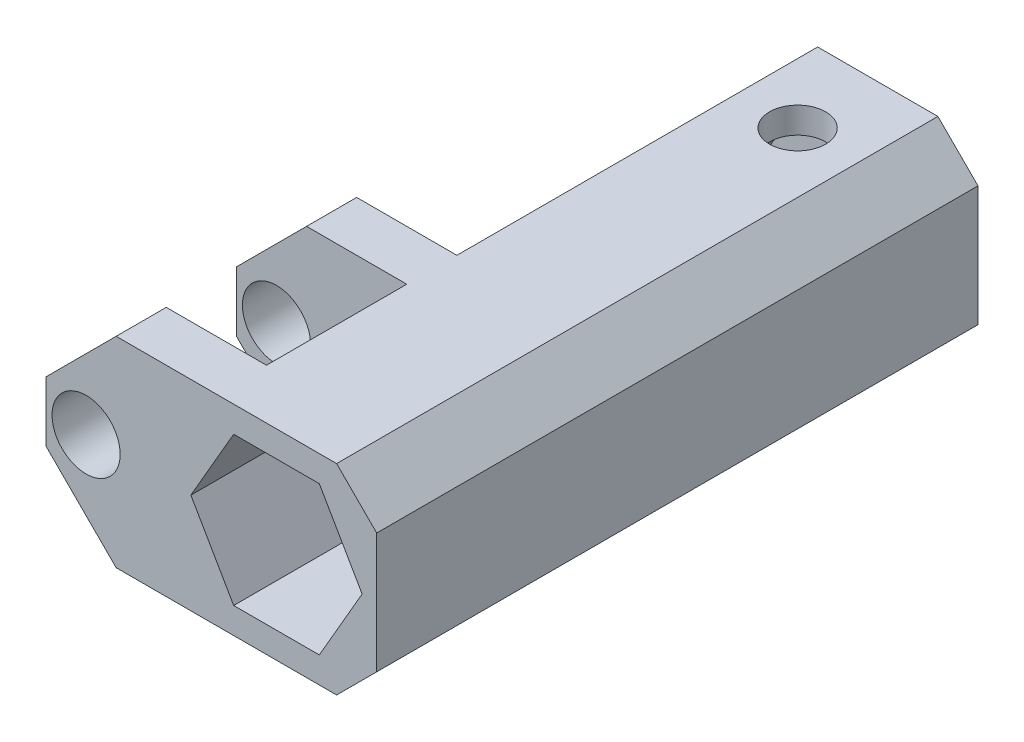
ISO-10303-21;
HEADER;
FILE_DESCRIPTION(('STEP AP214'),'2;1');
FILE_NAME('part.step','',(''),(''),'','','');
FILE_SCHEMA(('AUTOMOTIVE_DESIGN { 1 0 10303 214 1 1 1 1 }'));
ENDSEC;
DATA;
#1=APPLICATION_CONTEXT('core data for automotive mechanical design processes');
#2=APPLICATION_PROTOCOL_DEFINITION('international standard','automotive_design',2000,#1);
#3=PRODUCT_CONTEXT('',#1,'mechanical');
#4=PRODUCT('Part','Part','',(#3));
#5=PRODUCT_RELATED_PRODUCT_CATEGORY('part','',(#4));
#6=PRODUCT_DEFINITION_FORMATION('','',#4);
#7=PRODUCT_DEFINITION_CONTEXT('part definition',#1,'design');
#8=PRODUCT_DEFINITION('design','',#6,#7);
#9=PRODUCT_DEFINITION_SHAPE('','',#8);
#10=(LENGTH_UNIT() NAMED_UNIT(*) SI_UNIT(.MILLI.,.METRE.));
#11=(NAMED_UNIT(*) PLANE_ANGLE_UNIT() SI_UNIT($,.RADIAN.));
#12=(NAMED_UNIT(*) SI_UNIT($,.STERADIAN.) SOLID_ANGLE_UNIT());
#13=UNCERTAINTY_MEASURE_WITH_UNIT(LENGTH_MEASURE(1.E-05),#10,'distance_accuracy_value','');
#14=(GEOMETRIC_REPRESENTATION_CONTEXT(3) GLOBAL_UNCERTAINTY_ASSIGNED_CONTEXT((#13)) GLOBAL_UNIT_ASSIGNED_CONTEXT((#10,
#11,#12)) REPRESENTATION_CONTEXT('',''));
#15=CARTESIAN_POINT('',(0.,0.,0.));
#16=DIRECTION('',(0.,0.,1.));
#17=DIRECTION('',(1.,0.,0.));
#18=AXIS2_PLACEMENT_3D('',#15,#16,#17);
#19=CARTESIAN_POINT('',(-5.,-5.,30.));
#20=DIRECTION('',(1.,0.,0.));
#21=DIRECTION('',(0.,0.,-1.));
#22=AXIS2_PLACEMENT_3D('',#19,#20,#21);
#23=PLANE('',#22);
#24=DIRECTION('',(0.,-1.,0.));
#25=VECTOR('',#24,1.);
#26=CARTESIAN_POINT('',(-5.,5.,27.5));
#27=LINE('',#26,#25);
#28=CARTESIAN_POINT('',(-5.,3.00000000000001,27.5));
#29=VERTEX_POINT('',#28);
#30=CARTESIAN_POINT('',(-5.,-3.,27.5));
#31=VERTEX_POINT('',#30);
#32=EDGE_CURVE('E325',#29,#31,#27,.T.);
#33=ORIENTED_EDGE('',*,*,#32,.F.);
#34=DIRECTION('',(0.,0.,-1.));
#35=VECTOR('',#34,1.);
#36=CARTESIAN_POINT('',(-5.,3.00000000000001,30.));
#37=LINE('',#36,#35);
#38=CARTESIAN_POINT('',(-5.,3.00000000000001,20.5));
#39=VERTEX_POINT('',#38);
#40=EDGE_CURVE('E482',#29,#39,#37,.T.);
#41=ORIENTED_EDGE('',*,*,#40,.T.);
#42=DIRECTION('',(0.,1.,0.));
#43=VECTOR('',#42,1.);
#44=CARTESIAN_POINT('',(-5.,5.,20.5));
#45=LINE('',#44,#43);
#46=CARTESIAN_POINT('',(-5.,-3.,20.5));
#47=VERTEX_POINT('',#46);
#48=EDGE_CURVE('E488',#47,#39,#45,.T.);
#49=ORIENTED_EDGE('',*,*,#48,.F.);
#50=DIRECTION('',(0.,0.,1.));
#51=VECTOR('',#50,1.);
#52=CARTESIAN_POINT('',(-5.,-3.,30.));
#53=LINE('',#52,#51);
#54=EDGE_CURVE('E324',#47,#31,#53,.T.);
#55=ORIENTED_EDGE('',*,*,#54,.T.);
#56=EDGE_LOOP('',(#33,#41,#49,#55));
#57=FACE_BOUND('',#56,.T.);
#58=ADVANCED_FACE('F37',(#57),#23,.F.);
#59=DIRECTION('',(0.,-1.,0.));
#60=VECTOR('',#59,1.);
#61=CARTESIAN_POINT('',(-5.,5.,18.));
#62=LINE('',#61,#60);
#63=CARTESIAN_POINT('',(-5.,3.00000000000001,18.));
#64=VERTEX_POINT('',#63);
#65=CARTESIAN_POINT('',(-5.,-3.,18.));
#66=VERTEX_POINT('',#65);
#67=EDGE_CURVE('E525',#64,#66,#62,.T.);
#68=ORIENTED_EDGE('',*,*,#67,.F.);
#69=DIRECTION('',(0.,0.,-1.));
#70=VECTOR('',#69,1.);
#71=CARTESIAN_POINT('',(-5.,3.00000000000001,30.));
#72=LINE('',#71,#70);
#73=CARTESIAN_POINT('',(-5.,3.00000000000001,0.));
#74=VERTEX_POINT('',#73);
#75=EDGE_CURVE('E436',#64,#74,#72,.T.);
#76=ORIENTED_EDGE('',*,*,#75,.T.);
#77=DIRECTION('',(0.,-1.,0.));
#78=VECTOR('',#77,1.);
#79=CARTESIAN_POINT('',(-5.,-5.,0.));
#80=LINE('',#79,#78);
#81=CARTESIAN_POINT('',(-5.,-3.,0.));
#82=VERTEX_POINT('',#81);
#83=EDGE_CURVE('E259',#74,#82,#80,.T.);
#84=ORIENTED_EDGE('',*,*,#83,.T.);
#85=DIRECTION('',(0.,0.,1.));
#86=VECTOR('',#85,1.);
#87=CARTESIAN_POINT('',(-5.,-3.,30.));
#88=LINE('',#87,#86);
#89=EDGE_CURVE('E53',#82,#66,#88,.T.);
#90=ORIENTED_EDGE('',*,*,#89,.T.);
#91=EDGE_LOOP('',(#68,#76,#84,#90));
#92=FACE_BOUND('',#91,.T.);
#93=ADVANCED_FACE('F378',(#92),#23,.F.);
#94=CARTESIAN_POINT('',(5.,-5.,30.));
#95=DIRECTION('',(0.,1.,0.));
#96=DIRECTION('',(-1.,0.,0.));
#97=AXIS2_PLACEMENT_3D('',#94,#95,#96);
#98=PLANE('',#97);
#99=CARTESIAN_POINT('',(0.,-5.,4.));
#100=DIRECTION('',(0.,1.,0.));
#101=DIRECTION('',(-1.,0.,0.));
#102=AXIS2_PLACEMENT_3D('',#99,#100,#101);
#103=CIRCLE('',#102,1.4);
#104=CARTESIAN_POINT('',(-1.4,-5.,4.));
#105=VERTEX_POINT('',#104);
#106=EDGE_CURVE('E551',#105,#105,#103,.T.);
#107=ORIENTED_EDGE('',*,*,#106,.T.);
#108=EDGE_LOOP('',(#107));
#109=FACE_BOUND('',#108,.T.);
#110=DIRECTION('',(0.,0.,-1.));
#111=VECTOR('',#110,1.);
#112=CARTESIAN_POINT('',(-3.00000000000001,-5.,30.));
#113=LINE('',#112,#111);
#114=CARTESIAN_POINT('',(-3.00000000000001,-5.,27.5));
#115=VERTEX_POINT('',#114);
#116=CARTESIAN_POINT('',(-3.00000000000001,-5.,20.5));
#117=VERTEX_POINT('',#116);
#118=EDGE_CURVE('E468',#115,#117,#113,.T.);
#119=ORIENTED_EDGE('',*,*,#118,.T.);
#120=DIRECTION('',(1.,0.,0.));
#121=VECTOR('',#120,1.);
#122=CARTESIAN_POINT('',(-11.5,-5.,20.5));
#123=LINE('',#122,#121);
#124=CARTESIAN_POINT('',(-7.99999999999998,-5.,20.5));
#125=VERTEX_POINT('',#124);
#126=EDGE_CURVE('E497',#125,#117,#123,.T.);
#127=ORIENTED_EDGE('',*,*,#126,.F.);
#128=DIRECTION('',(0.,0.,-1.));
#129=VECTOR('',#128,1.);
#130=CARTESIAN_POINT('',(-7.99999999999998,-5.,30.));
#131=LINE('',#130,#129);
#132=CARTESIAN_POINT('',(-7.99999999999998,-5.,18.));
#133=VERTEX_POINT('',#132);
#134=EDGE_CURVE('E296',#125,#133,#131,.T.);
#135=ORIENTED_EDGE('',*,*,#134,.T.);
#136=DIRECTION('',(1.,0.,0.));
#137=VECTOR('',#136,1.);
#138=CARTESIAN_POINT('',(-11.5,-5.,18.));
#139=LINE('',#138,#137);
#140=CARTESIAN_POINT('',(-3.00000000000001,-5.,18.));
#141=VERTEX_POINT('',#140);
#142=EDGE_CURVE('E521',#133,#141,#139,.T.);
#143=ORIENTED_EDGE('',*,*,#142,.T.);
#144=DIRECTION('',(0.,0.,-1.));
#145=VECTOR('',#144,1.);
#146=CARTESIAN_POINT('',(-3.00000000000001,-5.,30.));
#147=LINE('',#146,#145);
#148=CARTESIAN_POINT('',(-3.,-5.,0.));
#149=VERTEX_POINT('',#148);
#150=EDGE_CURVE('E473',#141,#149,#147,.T.);
#151=ORIENTED_EDGE('',*,*,#150,.T.);
#152=DIRECTION('',(1.,0.,0.));
#153=VECTOR('',#152,1.);
#154=CARTESIAN_POINT('',(5.,-5.,0.));
#155=LINE('',#154,#153);
#156=CARTESIAN_POINT('',(3.,-5.,0.));
#157=VERTEX_POINT('',#156);
#158=EDGE_CURVE('E272',#149,#157,#155,.T.);
#159=ORIENTED_EDGE('',*,*,#158,.T.);
#160=DIRECTION('',(0.,0.,1.));
#161=VECTOR('',#160,1.);
#162=CARTESIAN_POINT('',(3.,-5.,30.));
#163=LINE('',#162,#161);
#164=CARTESIAN_POINT('',(3.,-5.,30.));
#165=VERTEX_POINT('',#164);
#166=EDGE_CURVE('E471',#157,#165,#163,.T.);
#167=ORIENTED_EDGE('',*,*,#166,.T.);
#168=DIRECTION('',(1.,0.,0.));
#169=VECTOR('',#168,1.);
#170=CARTESIAN_POINT('',(5.,-5.,30.));
#171=LINE('',#170,#169);
#172=CARTESIAN_POINT('',(-7.99999999999998,-5.,30.));
#173=VERTEX_POINT('',#172);
#174=EDGE_CURVE('E261',#173,#165,#171,.T.);
#175=ORIENTED_EDGE('',*,*,#174,.F.);
#176=DIRECTION('',(0.,0.,-1.));
#177=VECTOR('',#176,1.);
#178=CARTESIAN_POINT('',(-7.99999999999998,-5.,30.));
#179=LINE('',#178,#177);
#180=CARTESIAN_POINT('',(-7.99999999999998,-5.,27.5));
#181=VERTEX_POINT('',#180);
#182=EDGE_CURVE('E298',#173,#181,#179,.T.);
#183=ORIENTED_EDGE('',*,*,#182,.T.);
#184=DIRECTION('',(1.,0.,0.));
#185=VECTOR('',#184,1.);
#186=CARTESIAN_POINT('',(-11.5,-5.,27.5));
#187=LINE('',#186,#185);
#188=EDGE_CURVE('E289',#181,#115,#187,.T.);
#189=ORIENTED_EDGE('',*,*,#188,.T.);
#190=EDGE_LOOP('',(#119,#127,#135,#143,#151,#159,#167,#175,#183,#189));
#191=FACE_BOUND('',#190,.T.);
#192=ADVANCED_FACE('F384',(#109,#191),#98,.F.);
#193=CARTESIAN_POINT('',(5.,-5.,30.));
#194=DIRECTION('',(-1.,0.,0.));
#195=DIRECTION('',(0.,0.,1.));
#196=AXIS2_PLACEMENT_3D('',#193,#194,#195);
#197=PLANE('',#196);
#198=DIRECTION('',(0.,1.,0.));
#199=VECTOR('',#198,1.);
#200=CARTESIAN_POINT('',(5.,-5.,30.));
#201=LINE('',#200,#199);
#202=CARTESIAN_POINT('',(5.,-3.,30.));
#203=VERTEX_POINT('',#202);
#204=CARTESIAN_POINT('',(5.,2.99999999999999,30.));
#205=VERTEX_POINT('',#204);
#206=EDGE_CURVE('E264',#203,#205,#201,.T.);
#207=ORIENTED_EDGE('',*,*,#206,.F.);
#208=DIRECTION('',(0.,0.,-1.));
#209=VECTOR('',#208,1.);
#210=CARTESIAN_POINT('',(5.,-3.,30.));
#211=LINE('',#210,#209);
#212=CARTESIAN_POINT('',(5.,-3.00000000000001,0.));
#213=VERTEX_POINT('',#212);
#214=EDGE_CURVE('E463',#203,#213,#211,.T.);
#215=ORIENTED_EDGE('',*,*,#214,.T.);
#216=DIRECTION('',(0.,1.,0.));
#217=VECTOR('',#216,1.);
#218=CARTESIAN_POINT('',(5.,-5.,0.));
#219=LINE('',#218,#217);
#220=CARTESIAN_POINT('',(5.,2.99999999999999,0.));
#221=VERTEX_POINT('',#220);
#222=EDGE_CURVE('E275',#213,#221,#219,.T.);
#223=ORIENTED_EDGE('',*,*,#222,.T.);
#224=DIRECTION('',(0.,0.,1.));
#225=VECTOR('',#224,1.);
#226=CARTESIAN_POINT('',(5.,2.99999999999999,30.));
#227=LINE('',#226,#225);
#228=EDGE_CURVE('E466',#221,#205,#227,.T.);
#229=ORIENTED_EDGE('',*,*,#228,.T.);
#230=EDGE_LOOP('',(#207,#215,#223,#229));
#231=FACE_BOUND('',#230,.T.);
#232=ADVANCED_FACE('F670',(#231),#197,.F.);
#233=CARTESIAN_POINT('',(5.,5.,30.));
#234=DIRECTION('',(0.,-1.,0.));
#235=DIRECTION('',(1.,0.,0.));
#236=AXIS2_PLACEMENT_3D('',#233,#234,#235);
#237=PLANE('',#236);
#238=CARTESIAN_POINT('',(0.,5.,4.));
#239=DIRECTION('',(0.,1.,0.));
#240=DIRECTION('',(-1.,0.,0.));
#241=AXIS2_PLACEMENT_3D('',#238,#239,#240);
#242=CIRCLE('',#241,1.4);
#243=CARTESIAN_POINT('',(-1.4,5.,4.));
#244=VERTEX_POINT('',#243);
#245=EDGE_CURVE('E548',#244,#244,#242,.T.);
#246=ORIENTED_EDGE('',*,*,#245,.F.);
#247=EDGE_LOOP('',(#246));
#248=FACE_BOUND('',#247,.T.);
#249=DIRECTION('',(1.,0.,0.));
#250=VECTOR('',#249,1.);
#251=CARTESIAN_POINT('',(-11.5,5.,20.5));
#252=LINE('',#251,#250);
#253=CARTESIAN_POINT('',(-7.99999999999999,5.,20.5));
#254=VERTEX_POINT('',#253);
#255=CARTESIAN_POINT('',(-3.,5.,20.5));
#256=VERTEX_POINT('',#255);
#257=EDGE_CURVE('E330',#254,#256,#252,.T.);
#258=ORIENTED_EDGE('',*,*,#257,.T.);
#259=DIRECTION('',(0.,0.,1.));
#260=VECTOR('',#259,1.);
#261=CARTESIAN_POINT('',(-3.,5.,30.));
#262=LINE('',#261,#260);
#263=CARTESIAN_POINT('',(-3.,5.,27.5));
#264=VERTEX_POINT('',#263);
#265=EDGE_CURVE('E476',#256,#264,#262,.T.);
#266=ORIENTED_EDGE('',*,*,#265,.T.);
#267=DIRECTION('',(1.,0.,0.));
#268=VECTOR('',#267,1.);
#269=CARTESIAN_POINT('',(-11.5,5.,27.5));
#270=LINE('',#269,#268);
#271=CARTESIAN_POINT('',(-7.99999999999999,5.,27.5));
#272=VERTEX_POINT('',#271);
#273=EDGE_CURVE('E292',#272,#264,#270,.T.);
#274=ORIENTED_EDGE('',*,*,#273,.F.);
#275=DIRECTION('',(0.,0.,1.));
#276=VECTOR('',#275,1.);
#277=CARTESIAN_POINT('',(-7.99999999999999,5.,30.));
#278=LINE('',#277,#276);
#279=CARTESIAN_POINT('',(-7.99999999999999,5.,30.));
#280=VERTEX_POINT('',#279);
#281=EDGE_CURVE('E307',#272,#280,#278,.T.);
#282=ORIENTED_EDGE('',*,*,#281,.T.);
#283=DIRECTION('',(-1.,0.,0.));
#284=VECTOR('',#283,1.);
#285=CARTESIAN_POINT('',(5.,5.,30.));
#286=LINE('',#285,#284);
#287=CARTESIAN_POINT('',(3.,5.,30.));
#288=VERTEX_POINT('',#287);
#289=EDGE_CURVE('E268',#288,#280,#286,.T.);
#290=ORIENTED_EDGE('',*,*,#289,.F.);
#291=DIRECTION('',(0.,0.,-1.));
#292=VECTOR('',#291,1.);
#293=CARTESIAN_POINT('',(3.,5.,30.));
#294=LINE('',#293,#292);
#295=CARTESIAN_POINT('',(3.,5.,0.));
#296=VERTEX_POINT('',#295);
#297=EDGE_CURVE('E479',#288,#296,#294,.T.);
#298=ORIENTED_EDGE('',*,*,#297,.T.);
#299=DIRECTION('',(-1.,0.,0.));
#300=VECTOR('',#299,1.);
#301=CARTESIAN_POINT('',(5.,5.,0.));
#302=LINE('',#301,#300);
#303=CARTESIAN_POINT('',(-3.,5.,0.));
#304=VERTEX_POINT('',#303);
#305=EDGE_CURVE('E265',#296,#304,#302,.T.);
#306=ORIENTED_EDGE('',*,*,#305,.T.);
#307=DIRECTION('',(0.,0.,1.));
#308=VECTOR('',#307,1.);
#309=CARTESIAN_POINT('',(-3.,5.,30.));
#310=LINE('',#309,#308);
#311=CARTESIAN_POINT('',(-3.,5.,18.));
#312=VERTEX_POINT('',#311);
#313=EDGE_CURVE('E434',#304,#312,#310,.T.);
#314=ORIENTED_EDGE('',*,*,#313,.T.);
#315=DIRECTION('',(1.,0.,0.));
#316=VECTOR('',#315,1.);
#317=CARTESIAN_POINT('',(-11.5,5.,18.));
#318=LINE('',#317,#316);
#319=CARTESIAN_POINT('',(-7.99999999999999,5.,18.));
#320=VERTEX_POINT('',#319);
#321=EDGE_CURVE('E519',#320,#312,#318,.T.);
#322=ORIENTED_EDGE('',*,*,#321,.F.);
#323=DIRECTION('',(0.,0.,1.));
#324=VECTOR('',#323,1.);
#325=CARTESIAN_POINT('',(-7.99999999999999,5.,30.));
#326=LINE('',#325,#324);
#327=EDGE_CURVE('E305',#320,#254,#326,.T.);
#328=ORIENTED_EDGE('',*,*,#327,.T.);
#329=EDGE_LOOP('',(#258,#266,#274,#282,#290,#298,#306,#314,#322,#328));
#330=FACE_BOUND('',#329,.T.);
#331=ADVANCED_FACE('F674',(#248,#330),#237,.F.);
#332=CARTESIAN_POINT('',(0.,0.,30.));
#333=DIRECTION('',(0.,0.,1.));
#334=DIRECTION('',(1.,0.,0.));
#335=AXIS2_PLACEMENT_3D('',#332,#333,#334);
#336=PLANE('',#335);
#337=CARTESIAN_POINT('',(-9.5,0.,30.));
#338=DIRECTION('',(0.,0.,-1.));
#339=DIRECTION('',(0.,1.,0.));
#340=AXIS2_PLACEMENT_3D('',#337,#338,#339);
#341=CIRCLE('',#340,1.7);
#342=CARTESIAN_POINT('',(-9.5,1.7,30.));
#343=VERTEX_POINT('',#342);
#344=EDGE_CURVE('E539',#343,#343,#341,.T.);
#345=ORIENTED_EDGE('',*,*,#344,.T.);
#346=EDGE_LOOP('',(#345));
#347=FACE_BOUND('',#346,.T.);
#348=DIRECTION('',(-0.5,-0.866025403784439,0.));
#349=VECTOR('',#348,1.);
#350=CARTESIAN_POINT('',(-2.13619599600162,3.7,30.));
#351=LINE('',#350,#349);
#352=CARTESIAN_POINT('',(-2.13619599600162,3.7,30.));
#353=VERTEX_POINT('',#352);
#354=CARTESIAN_POINT('',(-4.27239199200323,0.,30.));
#355=VERTEX_POINT('',#354);
#356=EDGE_CURVE('E232',#353,#355,#351,.T.);
#357=ORIENTED_EDGE('',*,*,#356,.F.);
#358=DIRECTION('',(-1.,0.,0.));
#359=VECTOR('',#358,1.);
#360=CARTESIAN_POINT('',(2.13619599600162,3.7,30.));
#361=LINE('',#360,#359);
#362=CARTESIAN_POINT('',(2.13619599600162,3.7,30.));
#363=VERTEX_POINT('',#362);
#364=EDGE_CURVE('E246',#363,#353,#361,.T.);
#365=ORIENTED_EDGE('',*,*,#364,.F.);
#366=DIRECTION('',(-0.5,0.866025403784439,0.));
#367=VECTOR('',#366,1.);
#368=CARTESIAN_POINT('',(4.27239199200323,0.,30.));
#369=LINE('',#368,#367);
#370=CARTESIAN_POINT('',(4.27239199200323,0.,30.));
#371=VERTEX_POINT('',#370);
#372=EDGE_CURVE('E240',#371,#363,#369,.T.);
#373=ORIENTED_EDGE('',*,*,#372,.F.);
#374=DIRECTION('',(0.5,0.866025403784439,0.));
#375=VECTOR('',#374,1.);
#376=CARTESIAN_POINT('',(2.13619599600161,-3.7,30.));
#377=LINE('',#376,#375);
#378=CARTESIAN_POINT('',(2.13619599600161,-3.7,30.));
#379=VERTEX_POINT('',#378);
#380=EDGE_CURVE('E238',#379,#371,#377,.T.);
#381=ORIENTED_EDGE('',*,*,#380,.F.);
#382=DIRECTION('',(1.,0.,0.));
#383=VECTOR('',#382,1.);
#384=CARTESIAN_POINT('',(-2.13619599600162,-3.7,30.));
#385=LINE('',#384,#383);
#386=CARTESIAN_POINT('',(-2.13619599600162,-3.7,30.));
#387=VERTEX_POINT('',#386);
#388=EDGE_CURVE('E216',#387,#379,#385,.T.);
#389=ORIENTED_EDGE('',*,*,#388,.F.);
#390=DIRECTION('',(0.5,-0.866025403784439,0.));
#391=VECTOR('',#390,1.);
#392=CARTESIAN_POINT('',(-4.27239199200323,0.,30.));
#393=LINE('',#392,#391);
#394=EDGE_CURVE('E227',#355,#387,#393,.T.);
#395=ORIENTED_EDGE('',*,*,#394,.F.);
#396=EDGE_LOOP('',(#357,#365,#373,#381,#389,#395));
#397=FACE_BOUND('',#396,.T.);
#398=ORIENTED_EDGE('',*,*,#174,.T.);
#399=DIRECTION('',(-0.707106781186549,-0.707106781186546,0.));
#400=VECTOR('',#399,1.);
#401=CARTESIAN_POINT('',(3.99999999999999,-4.00000000000001,30.));
#402=LINE('',#401,#400);
#403=EDGE_CURVE('E451',#165,#203,#402,.F.);
#404=ORIENTED_EDGE('',*,*,#403,.T.);
#405=ORIENTED_EDGE('',*,*,#206,.T.);
#406=DIRECTION('',(0.707106781186546,-0.707106781186549,0.));
#407=VECTOR('',#406,1.);
#408=CARTESIAN_POINT('',(4.,3.99999999999999,30.));
#409=LINE('',#408,#407);
#410=EDGE_CURVE('E453',#205,#288,#409,.F.);
#411=ORIENTED_EDGE('',*,*,#410,.T.);
#412=ORIENTED_EDGE('',*,*,#289,.T.);
#413=DIRECTION('',(0.707106781186549,0.707106781186546,0.));
#414=VECTOR('',#413,1.);
#415=CARTESIAN_POINT('',(-6.49999999999998,6.5,30.));
#416=LINE('',#415,#414);
#417=CARTESIAN_POINT('',(-11.5,1.5,30.));
#418=VERTEX_POINT('',#417);
#419=EDGE_CURVE('E510',#280,#418,#416,.F.);
#420=ORIENTED_EDGE('',*,*,#419,.T.);
#421=DIRECTION('',(0.,1.,0.));
#422=VECTOR('',#421,1.);
#423=CARTESIAN_POINT('',(-11.5,5.,30.));
#424=LINE('',#423,#422);
#425=CARTESIAN_POINT('',(-11.5,-1.5,30.));
#426=VERTEX_POINT('',#425);
#427=EDGE_CURVE('E329',#426,#418,#424,.T.);
#428=ORIENTED_EDGE('',*,*,#427,.F.);
#429=DIRECTION('',(-0.707106781186549,0.707106781186546,0.));
#430=VECTOR('',#429,1.);
#431=CARTESIAN_POINT('',(-6.49999999999997,-6.5,30.));
#432=LINE('',#431,#430);
#433=EDGE_CURVE('E294',#426,#173,#432,.F.);
#434=ORIENTED_EDGE('',*,*,#433,.T.);
#435=EDGE_LOOP('',(#398,#404,#405,#411,#412,#420,#428,#434));
#436=FACE_BOUND('',#435,.T.);
#437=ADVANCED_FACE('F234',(#347,#397,#436),#336,.T.);
#438=CARTESIAN_POINT('',(0.,0.,0.));
#439=DIRECTION('',(0.,0.,1.));
#440=DIRECTION('',(1.,0.,0.));
#441=AXIS2_PLACEMENT_3D('',#438,#439,#440);
#442=PLANE('',#441);
#443=CARTESIAN_POINT('',(0.,0.,0.));
#444=DIRECTION('',(0.,0.,-1.));
#445=DIRECTION('',(-1.,0.,0.));
#446=AXIS2_PLACEMENT_3D('',#443,#444,#445);
#447=CIRCLE('',#446,1.6);
#448=CARTESIAN_POINT('',(-1.6,0.,0.));
#449=VERTEX_POINT('',#448);
#450=EDGE_CURVE('E283',#449,#449,#447,.T.);
#451=ORIENTED_EDGE('',*,*,#450,.F.);
#452=EDGE_LOOP('',(#451));
#453=FACE_BOUND('',#452,.T.);
#454=ORIENTED_EDGE('',*,*,#222,.F.);
#455=DIRECTION('',(0.707106781186549,0.707106781186546,0.));
#456=VECTOR('',#455,1.);
#457=CARTESIAN_POINT('',(5.,-3.,0.));
#458=LINE('',#457,#456);
#459=EDGE_CURVE('E455',#213,#157,#458,.F.);
#460=ORIENTED_EDGE('',*,*,#459,.T.);
#461=ORIENTED_EDGE('',*,*,#158,.F.);
#462=DIRECTION('',(0.707106781186546,-0.707106781186549,0.));
#463=VECTOR('',#462,1.);
#464=CARTESIAN_POINT('',(-3.00000000000001,-5.,0.));
#465=LINE('',#464,#463);
#466=EDGE_CURVE('E461',#149,#82,#465,.F.);
#467=ORIENTED_EDGE('',*,*,#466,.T.);
#468=ORIENTED_EDGE('',*,*,#83,.F.);
#469=DIRECTION('',(-0.707106781186549,-0.707106781186546,0.));
#470=VECTOR('',#469,1.);
#471=CARTESIAN_POINT('',(-5.,3.00000000000001,0.));
#472=LINE('',#471,#470);
#473=EDGE_CURVE('E459',#74,#304,#472,.F.);
#474=ORIENTED_EDGE('',*,*,#473,.T.);
#475=ORIENTED_EDGE('',*,*,#305,.F.);
#476=DIRECTION('',(-0.707106781186546,0.707106781186549,0.));
#477=VECTOR('',#476,1.);
#478=CARTESIAN_POINT('',(3.,5.,0.));
#479=LINE('',#478,#477);
#480=EDGE_CURVE('E457',#296,#221,#479,.F.);
#481=ORIENTED_EDGE('',*,*,#480,.T.);
#482=EDGE_LOOP('',(#454,#460,#461,#467,#468,#474,#475,#481));
#483=FACE_BOUND('',#482,.T.);
#484=ADVANCED_FACE('F759',(#453,#483),#442,.F.);
#485=CARTESIAN_POINT('',(-2.13619599600162,3.7,-11.3036867142244));
#486=DIRECTION('',(-0.866025403784439,0.5,0.));
#487=DIRECTION('',(-0.5,-0.866025403784439,0.));
#488=AXIS2_PLACEMENT_3D('',#485,#486,#487);
#489=PLANE('',#488);
#490=DIRECTION('',(0.5,0.866025403784439,0.));
#491=VECTOR('',#490,1.);
#492=CARTESIAN_POINT('',(-2.13619599600162,3.7,2.));
#493=LINE('',#492,#491);
#494=CARTESIAN_POINT('',(-4.27239199200323,0.,2.));
#495=VERTEX_POINT('',#494);
#496=CARTESIAN_POINT('',(-2.13619599600162,3.7,2.));
#497=VERTEX_POINT('',#496);
#498=EDGE_CURVE('E260',#495,#497,#493,.T.);
#499=ORIENTED_EDGE('',*,*,#498,.T.);
#500=DIRECTION('',(0.,0.,1.));
#501=VECTOR('',#500,1.);
#502=CARTESIAN_POINT('',(-2.13619599600162,3.7,-11.3036867142244));
#503=LINE('',#502,#501);
#504=EDGE_CURVE('E249',#497,#353,#503,.T.);
#505=ORIENTED_EDGE('',*,*,#504,.T.);
#506=ORIENTED_EDGE('',*,*,#356,.T.);
#507=DIRECTION('',(0.,0.,1.));
#508=VECTOR('',#507,1.);
#509=CARTESIAN_POINT('',(-4.27239199200323,0.,-11.3036867142244));
#510=LINE('',#509,#508);
#511=EDGE_CURVE('E223',#495,#355,#510,.T.);
#512=ORIENTED_EDGE('',*,*,#511,.F.);
#513=EDGE_LOOP('',(#499,#505,#506,#512));
#514=FACE_BOUND('',#513,.T.);
#515=ADVANCED_FACE('F346',(#514),#489,.F.);
#516=CARTESIAN_POINT('',(2.13619599600162,3.7,-11.3036867142244));
#517=DIRECTION('',(0.,1.,0.));
#518=DIRECTION('',(0.,0.,1.));
#519=AXIS2_PLACEMENT_3D('',#516,#517,#518);
#520=PLANE('',#519);
#521=CARTESIAN_POINT('',(0.,3.7,4.));
#522=DIRECTION('',(0.,1.,0.));
#523=DIRECTION('',(0.,0.,1.));
#524=AXIS2_PLACEMENT_3D('',#521,#522,#523);
#525=CIRCLE('',#524,1.4);
#526=CARTESIAN_POINT('',(0.,3.7,5.4));
#527=VERTEX_POINT('',#526);
#528=EDGE_CURVE('E543',#527,#527,#525,.T.);
#529=ORIENTED_EDGE('',*,*,#528,.T.);
#530=EDGE_LOOP('',(#529));
#531=FACE_BOUND('',#530,.T.);
#532=DIRECTION('',(1.,0.,0.));
#533=VECTOR('',#532,1.);
#534=CARTESIAN_POINT('',(2.13619599600162,3.7,2.));
#535=LINE('',#534,#533);
#536=CARTESIAN_POINT('',(2.13619599600162,3.7,2.));
#537=VERTEX_POINT('',#536);
#538=EDGE_CURVE('E343',#497,#537,#535,.T.);
#539=ORIENTED_EDGE('',*,*,#538,.T.);
#540=DIRECTION('',(0.,0.,1.));
#541=VECTOR('',#540,1.);
#542=CARTESIAN_POINT('',(2.13619599600162,3.7,-11.3036867142244));
#543=LINE('',#542,#541);
#544=EDGE_CURVE('E251',#537,#363,#543,.T.);
#545=ORIENTED_EDGE('',*,*,#544,.T.);
#546=ORIENTED_EDGE('',*,*,#364,.T.);
#547=ORIENTED_EDGE('',*,*,#504,.F.);
#548=EDGE_LOOP('',(#539,#545,#546,#547));
#549=FACE_BOUND('',#548,.T.);
#550=ADVANCED_FACE('F350',(#531,#549),#520,.F.);
#551=CARTESIAN_POINT('',(4.27239199200323,0.,-11.3036867142244));
#552=DIRECTION('',(0.866025403784439,0.5,0.));
#553=DIRECTION('',(-0.5,0.866025403784439,0.));
#554=AXIS2_PLACEMENT_3D('',#551,#552,#553);
#555=PLANE('',#554);
#556=DIRECTION('',(0.5,-0.866025403784439,0.));
#557=VECTOR('',#556,1.);
#558=CARTESIAN_POINT('',(4.27239199200323,0.,2.));
#559=LINE('',#558,#557);
#560=CARTESIAN_POINT('',(4.27239199200323,0.,2.));
#561=VERTEX_POINT('',#560);
#562=EDGE_CURVE('E341',#537,#561,#559,.T.);
#563=ORIENTED_EDGE('',*,*,#562,.T.);
#564=DIRECTION('',(0.,0.,1.));
#565=VECTOR('',#564,1.);
#566=CARTESIAN_POINT('',(4.27239199200323,0.,-11.3036867142244));
#567=LINE('',#566,#565);
#568=EDGE_CURVE('E253',#561,#371,#567,.T.);
#569=ORIENTED_EDGE('',*,*,#568,.T.);
#570=ORIENTED_EDGE('',*,*,#372,.T.);
#571=ORIENTED_EDGE('',*,*,#544,.F.);
#572=EDGE_LOOP('',(#563,#569,#570,#571));
#573=FACE_BOUND('',#572,.T.);
#574=ADVANCED_FACE('F355',(#573),#555,.F.);
#575=CARTESIAN_POINT('',(2.13619599600161,-3.7,-11.3036867142244));
#576=DIRECTION('',(0.866025403784439,-0.5,0.));
#577=DIRECTION('',(0.5,0.866025403784439,0.));
#578=AXIS2_PLACEMENT_3D('',#575,#576,#577);
#579=PLANE('',#578);
#580=DIRECTION('',(-0.5,-0.866025403784439,0.));
#581=VECTOR('',#580,1.);
#582=CARTESIAN_POINT('',(2.13619599600161,-3.7,2.));
#583=LINE('',#582,#581);
#584=CARTESIAN_POINT('',(2.13619599600162,-3.7,2.));
#585=VERTEX_POINT('',#584);
#586=EDGE_CURVE('E339',#561,#585,#583,.T.);
#587=ORIENTED_EDGE('',*,*,#586,.T.);
#588=DIRECTION('',(0.,0.,1.));
#589=VECTOR('',#588,1.);
#590=CARTESIAN_POINT('',(2.13619599600161,-3.7,-11.3036867142244));
#591=LINE('',#590,#589);
#592=EDGE_CURVE('E222',#585,#379,#591,.T.);
#593=ORIENTED_EDGE('',*,*,#592,.T.);
#594=ORIENTED_EDGE('',*,*,#380,.T.);
#595=ORIENTED_EDGE('',*,*,#568,.F.);
#596=EDGE_LOOP('',(#587,#593,#594,#595));
#597=FACE_BOUND('',#596,.T.);
#598=ADVANCED_FACE('F359',(#597),#579,.F.);
#599=CARTESIAN_POINT('',(-2.13619599600162,-3.7,-11.3036867142244));
#600=DIRECTION('',(0.,-1.,0.));
#601=DIRECTION('',(1.,0.,0.));
#602=AXIS2_PLACEMENT_3D('',#599,#600,#601);
#603=PLANE('',#602);
#604=CARTESIAN_POINT('',(0.,-3.7,4.));
#605=DIRECTION('',(0.,-1.,0.));
#606=DIRECTION('',(1.,0.,0.));
#607=AXIS2_PLACEMENT_3D('',#604,#605,#606);
#608=CIRCLE('',#607,1.4);
#609=CARTESIAN_POINT('',(1.4,-3.7,4.));
#610=VERTEX_POINT('',#609);
#611=EDGE_CURVE('E41',#610,#610,#608,.T.);
#612=ORIENTED_EDGE('',*,*,#611,.T.);
#613=EDGE_LOOP('',(#612));
#614=FACE_BOUND('',#613,.T.);
#615=DIRECTION('',(-1.,0.,0.));
#616=VECTOR('',#615,1.);
#617=CARTESIAN_POINT('',(-2.13619599600162,-3.7,2.));
#618=LINE('',#617,#616);
#619=CARTESIAN_POINT('',(-2.13619599600162,-3.7,2.));
#620=VERTEX_POINT('',#619);
#621=EDGE_CURVE('E219',#585,#620,#618,.T.);
#622=ORIENTED_EDGE('',*,*,#621,.T.);
#623=DIRECTION('',(0.,0.,1.));
#624=VECTOR('',#623,1.);
#625=CARTESIAN_POINT('',(-2.13619599600162,-3.7,-11.3036867142244));
#626=LINE('',#625,#624);
#627=EDGE_CURVE('E211',#620,#387,#626,.T.);
#628=ORIENTED_EDGE('',*,*,#627,.T.);
#629=ORIENTED_EDGE('',*,*,#388,.T.);
#630=ORIENTED_EDGE('',*,*,#592,.F.);
#631=EDGE_LOOP('',(#622,#628,#629,#630));
#632=FACE_BOUND('',#631,.T.);
#633=ADVANCED_FACE('F213',(#614,#632),#603,.F.);
#634=CARTESIAN_POINT('',(-4.27239199200323,0.,-11.3036867142244));
#635=DIRECTION('',(-0.866025403784439,-0.5,0.));
#636=DIRECTION('',(0.5,-0.866025403784439,0.));
#637=AXIS2_PLACEMENT_3D('',#634,#635,#636);
#638=PLANE('',#637);
#639=DIRECTION('',(-0.5,0.866025403784439,0.));
#640=VECTOR('',#639,1.);
#641=CARTESIAN_POINT('',(-4.27239199200323,0.,2.));
#642=LINE('',#641,#640);
#643=EDGE_CURVE('E257',#620,#495,#642,.T.);
#644=ORIENTED_EDGE('',*,*,#643,.T.);
#645=ORIENTED_EDGE('',*,*,#511,.T.);
#646=ORIENTED_EDGE('',*,*,#394,.T.);
#647=ORIENTED_EDGE('',*,*,#627,.F.);
#648=EDGE_LOOP('',(#644,#645,#646,#647));
#649=FACE_BOUND('',#648,.T.);
#650=ADVANCED_FACE('F228',(#649),#638,.F.);
#651=CARTESIAN_POINT('',(0.,0.,2.));
#652=DIRECTION('',(0.,0.,1.));
#653=DIRECTION('',(1.,0.,0.));
#654=AXIS2_PLACEMENT_3D('',#651,#652,#653);
#655=PLANE('',#654);
#656=CARTESIAN_POINT('',(0.,0.,2.));
#657=DIRECTION('',(0.,0.,1.));
#658=DIRECTION('',(1.,0.,0.));
#659=AXIS2_PLACEMENT_3D('',#656,#657,#658);
#660=CIRCLE('',#659,1.6);
#661=CARTESIAN_POINT('',(1.6,0.,2.));
#662=VERTEX_POINT('',#661);
#663=EDGE_CURVE('E280',#662,#662,#660,.T.);
#664=ORIENTED_EDGE('',*,*,#663,.F.);
#665=EDGE_LOOP('',(#664));
#666=FACE_BOUND('',#665,.T.);
#667=ORIENTED_EDGE('',*,*,#498,.F.);
#668=ORIENTED_EDGE('',*,*,#643,.F.);
#669=ORIENTED_EDGE('',*,*,#621,.F.);
#670=ORIENTED_EDGE('',*,*,#586,.F.);
#671=ORIENTED_EDGE('',*,*,#562,.F.);
#672=ORIENTED_EDGE('',*,*,#538,.F.);
#673=EDGE_LOOP('',(#667,#668,#669,#670,#671,#672));
#674=FACE_BOUND('',#673,.T.);
#675=ADVANCED_FACE('F362',(#666,#674),#655,.T.);
#676=CARTESIAN_POINT('',(0.,0.,30.));
#677=DIRECTION('',(0.,0.,-1.));
#678=DIRECTION('',(-1.,0.,0.));
#679=AXIS2_PLACEMENT_3D('',#676,#677,#678);
#680=CYLINDRICAL_SURFACE('',#679,1.6);
#681=ORIENTED_EDGE('',*,*,#663,.T.);
#682=EDGE_LOOP('',(#681));
#683=FACE_BOUND('',#682,.T.);
#684=ORIENTED_EDGE('',*,*,#450,.T.);
#685=EDGE_LOOP('',(#684));
#686=FACE_BOUND('',#685,.T.);
#687=ADVANCED_FACE('F364',(#683,#686),#680,.F.);
#688=CARTESIAN_POINT('',(-11.5,5.,27.5));
#689=DIRECTION('',(0.,0.,1.));
#690=DIRECTION('',(1.,0.,0.));
#691=AXIS2_PLACEMENT_3D('',#688,#689,#690);
#692=PLANE('',#691);
#693=CARTESIAN_POINT('',(-9.5,0.,27.5));
#694=DIRECTION('',(0.,0.,1.));
#695=DIRECTION('',(1.,0.,0.));
#696=AXIS2_PLACEMENT_3D('',#693,#694,#695);
#697=CIRCLE('',#696,1.7);
#698=CARTESIAN_POINT('',(-7.8,0.,27.5));
#699=VERTEX_POINT('',#698);
#700=EDGE_CURVE('E529',#699,#699,#697,.T.);
#701=ORIENTED_EDGE('',*,*,#700,.T.);
#702=EDGE_LOOP('',(#701));
#703=FACE_BOUND('',#702,.T.);
#704=ORIENTED_EDGE('',*,*,#188,.F.);
#705=DIRECTION('',(0.707106781186549,-0.707106781186546,0.));
#706=VECTOR('',#705,1.);
#707=CARTESIAN_POINT('',(-11.5,-1.5,27.5));
#708=LINE('',#707,#706);
#709=CARTESIAN_POINT('',(-11.5,-1.5,27.5));
#710=VERTEX_POINT('',#709);
#711=EDGE_CURVE('E303',#181,#710,#708,.F.);
#712=ORIENTED_EDGE('',*,*,#711,.T.);
#713=DIRECTION('',(0.,-1.,0.));
#714=VECTOR('',#713,1.);
#715=CARTESIAN_POINT('',(-11.5,5.,27.5));
#716=LINE('',#715,#714);
#717=CARTESIAN_POINT('',(-11.5,1.5,27.5));
#718=VERTEX_POINT('',#717);
#719=EDGE_CURVE('E293',#718,#710,#716,.T.);
#720=ORIENTED_EDGE('',*,*,#719,.F.);
#721=DIRECTION('',(-0.707106781186549,-0.707106781186546,0.));
#722=VECTOR('',#721,1.);
#723=CARTESIAN_POINT('',(-11.5,1.5,27.5));
#724=LINE('',#723,#722);
#725=EDGE_CURVE('E300',#718,#272,#724,.F.);
#726=ORIENTED_EDGE('',*,*,#725,.T.);
#727=ORIENTED_EDGE('',*,*,#273,.T.);
#728=DIRECTION('',(0.707106781186549,0.707106781186546,0.));
#729=VECTOR('',#728,1.);
#730=CARTESIAN_POINT('',(-7.25000000000002,0.749999999999998,27.5));
#731=LINE('',#730,#729);
#732=EDGE_CURVE('E444',#264,#29,#731,.F.);
#733=ORIENTED_EDGE('',*,*,#732,.T.);
#734=ORIENTED_EDGE('',*,*,#32,.T.);
#735=DIRECTION('',(-0.707106781186546,0.707106781186549,0.));
#736=VECTOR('',#735,1.);
#737=CARTESIAN_POINT('',(-12.25,4.25000000000002,27.5));
#738=LINE('',#737,#736);
#739=EDGE_CURVE('E437',#31,#115,#738,.F.);
#740=ORIENTED_EDGE('',*,*,#739,.T.);
#741=EDGE_LOOP('',(#704,#712,#720,#726,#727,#733,#734,#740));
#742=FACE_BOUND('',#741,.T.);
#743=ADVANCED_FACE('F371',(#703,#742),#692,.F.);
#744=CARTESIAN_POINT('',(-11.5,0.,0.));
#745=DIRECTION('',(1.,0.,0.));
#746=DIRECTION('',(0.,0.,-1.));
#747=AXIS2_PLACEMENT_3D('',#744,#745,#746);
#748=PLANE('',#747);
#749=ORIENTED_EDGE('',*,*,#719,.T.);
#750=DIRECTION('',(0.,0.,1.));
#751=VECTOR('',#750,1.);
#752=CARTESIAN_POINT('',(-11.5,-1.5,0.));
#753=LINE('',#752,#751);
#754=EDGE_CURVE('E506',#710,#426,#753,.T.);
#755=ORIENTED_EDGE('',*,*,#754,.T.);
#756=ORIENTED_EDGE('',*,*,#427,.T.);
#757=DIRECTION('',(0.,0.,-1.));
#758=VECTOR('',#757,1.);
#759=CARTESIAN_POINT('',(-11.5,1.5,0.));
#760=LINE('',#759,#758);
#761=EDGE_CURVE('E270',#418,#718,#760,.T.);
#762=ORIENTED_EDGE('',*,*,#761,.T.);
#763=EDGE_LOOP('',(#749,#755,#756,#762));
#764=FACE_BOUND('',#763,.T.);
#765=ADVANCED_FACE('F514',(#764),#748,.F.);
#766=CARTESIAN_POINT('',(-11.5,5.,20.5));
#767=DIRECTION('',(0.,0.,-1.));
#768=DIRECTION('',(-1.,0.,0.));
#769=AXIS2_PLACEMENT_3D('',#766,#767,#768);
#770=PLANE('',#769);
#771=CARTESIAN_POINT('',(-9.5,0.,20.5));
#772=DIRECTION('',(0.,0.,-1.));
#773=DIRECTION('',(-1.,0.,0.));
#774=AXIS2_PLACEMENT_3D('',#771,#772,#773);
#775=CIRCLE('',#774,1.7);
#776=CARTESIAN_POINT('',(-11.2,0.,20.5));
#777=VERTEX_POINT('',#776);
#778=EDGE_CURVE('E536',#777,#777,#775,.T.);
#779=ORIENTED_EDGE('',*,*,#778,.T.);
#780=EDGE_LOOP('',(#779));
#781=FACE_BOUND('',#780,.T.);
#782=DIRECTION('',(0.,1.,0.));
#783=VECTOR('',#782,1.);
#784=CARTESIAN_POINT('',(-11.5,5.,20.5));
#785=LINE('',#784,#783);
#786=CARTESIAN_POINT('',(-11.5,-1.5,20.5));
#787=VERTEX_POINT('',#786);
#788=CARTESIAN_POINT('',(-11.5,1.5,20.5));
#789=VERTEX_POINT('',#788);
#790=EDGE_CURVE('E527',#787,#789,#785,.T.);
#791=ORIENTED_EDGE('',*,*,#790,.F.);
#792=DIRECTION('',(-0.707106781186549,0.707106781186546,0.));
#793=VECTOR('',#792,1.);
#794=CARTESIAN_POINT('',(-11.5,-1.5,20.5));
#795=LINE('',#794,#793);
#796=EDGE_CURVE('E318',#787,#125,#795,.F.);
#797=ORIENTED_EDGE('',*,*,#796,.T.);
#798=ORIENTED_EDGE('',*,*,#126,.T.);
#799=DIRECTION('',(0.707106781186546,-0.707106781186549,0.));
#800=VECTOR('',#799,1.);
#801=CARTESIAN_POINT('',(-12.25,4.25000000000002,20.5));
#802=LINE('',#801,#800);
#803=EDGE_CURVE('E440',#117,#47,#802,.F.);
#804=ORIENTED_EDGE('',*,*,#803,.T.);
#805=ORIENTED_EDGE('',*,*,#48,.T.);
#806=DIRECTION('',(-0.707106781186549,-0.707106781186546,0.));
#807=VECTOR('',#806,1.);
#808=CARTESIAN_POINT('',(-7.25000000000002,0.749999999999999,20.5));
#809=LINE('',#808,#807);
#810=EDGE_CURVE('E446',#39,#256,#809,.F.);
#811=ORIENTED_EDGE('',*,*,#810,.T.);
#812=ORIENTED_EDGE('',*,*,#257,.F.);
#813=DIRECTION('',(0.707106781186549,0.707106781186546,0.));
#814=VECTOR('',#813,1.);
#815=CARTESIAN_POINT('',(-11.5,1.5,20.5));
#816=LINE('',#815,#814);
#817=EDGE_CURVE('E316',#254,#789,#816,.F.);
#818=ORIENTED_EDGE('',*,*,#817,.T.);
#819=EDGE_LOOP('',(#791,#797,#798,#804,#805,#811,#812,#818));
#820=FACE_BOUND('',#819,.T.);
#821=ADVANCED_FACE('F577',(#781,#820),#770,.F.);
#822=CARTESIAN_POINT('',(-11.5,5.,18.));
#823=DIRECTION('',(0.,0.,1.));
#824=DIRECTION('',(1.,0.,0.));
#825=AXIS2_PLACEMENT_3D('',#822,#823,#824);
#826=PLANE('',#825);
#827=CARTESIAN_POINT('',(-9.5,0.,18.));
#828=DIRECTION('',(0.,0.,-1.));
#829=DIRECTION('',(0.,1.,0.));
#830=AXIS2_PLACEMENT_3D('',#827,#828,#829);
#831=CIRCLE('',#830,1.7);
#832=CARTESIAN_POINT('',(-9.5,1.7,18.));
#833=VERTEX_POINT('',#832);
#834=EDGE_CURVE('E540',#833,#833,#831,.T.);
#835=ORIENTED_EDGE('',*,*,#834,.F.);
#836=EDGE_LOOP('',(#835));
#837=FACE_BOUND('',#836,.T.);
#838=ORIENTED_EDGE('',*,*,#142,.F.);
#839=DIRECTION('',(0.707106781186549,-0.707106781186546,0.));
#840=VECTOR('',#839,1.);
#841=CARTESIAN_POINT('',(-11.5,-1.5,18.));
#842=LINE('',#841,#840);
#843=CARTESIAN_POINT('',(-11.5,-1.5,18.));
#844=VERTEX_POINT('',#843);
#845=EDGE_CURVE('E322',#133,#844,#842,.F.);
#846=ORIENTED_EDGE('',*,*,#845,.T.);
#847=DIRECTION('',(0.,-1.,0.));
#848=VECTOR('',#847,1.);
#849=CARTESIAN_POINT('',(-11.5,5.,18.));
#850=LINE('',#849,#848);
#851=CARTESIAN_POINT('',(-11.5,1.5,18.));
#852=VERTEX_POINT('',#851);
#853=EDGE_CURVE('E524',#852,#844,#850,.T.);
#854=ORIENTED_EDGE('',*,*,#853,.F.);
#855=DIRECTION('',(-0.707106781186549,-0.707106781186546,0.));
#856=VECTOR('',#855,1.);
#857=CARTESIAN_POINT('',(-11.5,1.5,18.));
#858=LINE('',#857,#856);
#859=EDGE_CURVE('E320',#852,#320,#858,.F.);
#860=ORIENTED_EDGE('',*,*,#859,.T.);
#861=ORIENTED_EDGE('',*,*,#321,.T.);
#862=DIRECTION('',(0.707106781186549,0.707106781186546,0.));
#863=VECTOR('',#862,1.);
#864=CARTESIAN_POINT('',(-7.25000000000002,0.749999999999999,18.));
#865=LINE('',#864,#863);
#866=EDGE_CURVE('E46',#312,#64,#865,.F.);
#867=ORIENTED_EDGE('',*,*,#866,.T.);
#868=ORIENTED_EDGE('',*,*,#67,.T.);
#869=DIRECTION('',(-0.707106781186546,0.707106781186549,0.));
#870=VECTOR('',#869,1.);
#871=CARTESIAN_POINT('',(-12.25,4.25000000000001,18.));
#872=LINE('',#871,#870);
#873=EDGE_CURVE('E12',#66,#141,#872,.F.);
#874=ORIENTED_EDGE('',*,*,#873,.T.);
#875=EDGE_LOOP('',(#838,#846,#854,#860,#861,#867,#868,#874));
#876=FACE_BOUND('',#875,.T.);
#877=ADVANCED_FACE('F573',(#837,#876),#826,.F.);
#878=CARTESIAN_POINT('',(-11.5,0.,0.));
#879=DIRECTION('',(1.,0.,0.));
#880=DIRECTION('',(0.,0.,-1.));
#881=AXIS2_PLACEMENT_3D('',#878,#879,#880);
#882=PLANE('',#881);
#883=ORIENTED_EDGE('',*,*,#853,.T.);
#884=DIRECTION('',(0.,0.,1.));
#885=VECTOR('',#884,1.);
#886=CARTESIAN_POINT('',(-11.5,-1.5,0.));
#887=LINE('',#886,#885);
#888=EDGE_CURVE('E313',#844,#787,#887,.T.);
#889=ORIENTED_EDGE('',*,*,#888,.T.);
#890=ORIENTED_EDGE('',*,*,#790,.T.);
#891=DIRECTION('',(0.,0.,-1.));
#892=VECTOR('',#891,1.);
#893=CARTESIAN_POINT('',(-11.5,1.5,0.));
#894=LINE('',#893,#892);
#895=EDGE_CURVE('E310',#789,#852,#894,.T.);
#896=ORIENTED_EDGE('',*,*,#895,.T.);
#897=EDGE_LOOP('',(#883,#889,#890,#896));
#898=FACE_BOUND('',#897,.T.);
#899=ADVANCED_FACE('F393',(#898),#882,.F.);
#900=CARTESIAN_POINT('',(-11.5,-1.5,0.));
#901=DIRECTION('',(0.707106781186546,0.707106781186549,0.));
#902=DIRECTION('',(0.,0.,1.));
#903=AXIS2_PLACEMENT_3D('',#900,#901,#902);
#904=PLANE('',#903);
#905=ORIENTED_EDGE('',*,*,#711,.F.);
#906=ORIENTED_EDGE('',*,*,#182,.F.);
#907=ORIENTED_EDGE('',*,*,#433,.F.);
#908=ORIENTED_EDGE('',*,*,#754,.F.);
#909=EDGE_LOOP('',(#905,#906,#907,#908));
#910=FACE_BOUND('',#909,.T.);
#911=ADVANCED_FACE('F389',(#910),#904,.F.);
#912=CARTESIAN_POINT('',(-11.5,1.5,0.));
#913=DIRECTION('',(0.707106781186546,-0.707106781186549,0.));
#914=DIRECTION('',(0.,0.,-1.));
#915=AXIS2_PLACEMENT_3D('',#912,#913,#914);
#916=PLANE('',#915);
#917=ORIENTED_EDGE('',*,*,#419,.F.);
#918=ORIENTED_EDGE('',*,*,#281,.F.);
#919=ORIENTED_EDGE('',*,*,#725,.F.);
#920=ORIENTED_EDGE('',*,*,#761,.F.);
#921=EDGE_LOOP('',(#917,#918,#919,#920));
#922=FACE_BOUND('',#921,.T.);
#923=ADVANCED_FACE('F392',(#922),#916,.F.);
#924=CARTESIAN_POINT('',(-11.5,-1.5,0.));
#925=DIRECTION('',(0.707106781186546,0.707106781186549,0.));
#926=DIRECTION('',(0.,0.,1.));
#927=AXIS2_PLACEMENT_3D('',#924,#925,#926);
#928=PLANE('',#927);
#929=ORIENTED_EDGE('',*,*,#845,.F.);
#930=ORIENTED_EDGE('',*,*,#134,.F.);
#931=ORIENTED_EDGE('',*,*,#796,.F.);
#932=ORIENTED_EDGE('',*,*,#888,.F.);
#933=EDGE_LOOP('',(#929,#930,#931,#932));
#934=FACE_BOUND('',#933,.T.);
#935=ADVANCED_FACE('F397',(#934),#928,.F.);
#936=CARTESIAN_POINT('',(-11.5,1.5,0.));
#937=DIRECTION('',(0.707106781186546,-0.707106781186549,0.));
#938=DIRECTION('',(0.,0.,-1.));
#939=AXIS2_PLACEMENT_3D('',#936,#937,#938);
#940=PLANE('',#939);
#941=ORIENTED_EDGE('',*,*,#817,.F.);
#942=ORIENTED_EDGE('',*,*,#327,.F.);
#943=ORIENTED_EDGE('',*,*,#859,.F.);
#944=ORIENTED_EDGE('',*,*,#895,.F.);
#945=EDGE_LOOP('',(#941,#942,#943,#944));
#946=FACE_BOUND('',#945,.T.);
#947=ADVANCED_FACE('F401',(#946),#940,.F.);
#948=CARTESIAN_POINT('',(-9.5,0.,30.));
#949=DIRECTION('',(0.,0.,-1.));
#950=DIRECTION('',(0.,1.,0.));
#951=AXIS2_PLACEMENT_3D('',#948,#949,#950);
#952=CYLINDRICAL_SURFACE('',#951,1.7);
#953=ORIENTED_EDGE('',*,*,#834,.T.);
#954=EDGE_LOOP('',(#953));
#955=FACE_BOUND('',#954,.T.);
#956=ORIENTED_EDGE('',*,*,#778,.F.);
#957=EDGE_LOOP('',(#956));
#958=FACE_BOUND('',#957,.T.);
#959=ADVANCED_FACE('F405',(#955,#958),#952,.F.);
#960=ORIENTED_EDGE('',*,*,#344,.F.);
#961=EDGE_LOOP('',(#960));
#962=FACE_BOUND('',#961,.T.);
#963=ORIENTED_EDGE('',*,*,#700,.F.);
#964=EDGE_LOOP('',(#963));
#965=FACE_BOUND('',#964,.T.);
#966=ADVANCED_FACE('F411',(#962,#965),#952,.F.);
#967=CARTESIAN_POINT('',(-5.,3.00000000000001,30.));
#968=DIRECTION('',(0.707106781186546,-0.707106781186549,0.));
#969=DIRECTION('',(0.,0.,-1.));
#970=AXIS2_PLACEMENT_3D('',#967,#968,#969);
#971=PLANE('',#970);
#972=ORIENTED_EDGE('',*,*,#732,.F.);
#973=ORIENTED_EDGE('',*,*,#265,.F.);
#974=ORIENTED_EDGE('',*,*,#810,.F.);
#975=ORIENTED_EDGE('',*,*,#40,.F.);
#976=EDGE_LOOP('',(#972,#973,#974,#975));
#977=FACE_BOUND('',#976,.T.);
#978=ADVANCED_FACE('F407',(#977),#971,.F.);
#979=CARTESIAN_POINT('',(-3.00000000000001,-5.,30.));
#980=DIRECTION('',(0.707106781186549,0.707106781186546,0.));
#981=DIRECTION('',(0.,0.,-1.));
#982=AXIS2_PLACEMENT_3D('',#979,#980,#981);
#983=PLANE('',#982);
#984=ORIENTED_EDGE('',*,*,#739,.F.);
#985=ORIENTED_EDGE('',*,*,#54,.F.);
#986=ORIENTED_EDGE('',*,*,#803,.F.);
#987=ORIENTED_EDGE('',*,*,#118,.F.);
#988=EDGE_LOOP('',(#984,#985,#986,#987));
#989=FACE_BOUND('',#988,.T.);
#990=ADVANCED_FACE('F410',(#989),#983,.F.);
#991=CARTESIAN_POINT('',(5.,-3.,30.));
#992=DIRECTION('',(-0.707106781186546,0.707106781186549,0.));
#993=DIRECTION('',(0.,0.,-1.));
#994=AXIS2_PLACEMENT_3D('',#991,#992,#993);
#995=PLANE('',#994);
#996=ORIENTED_EDGE('',*,*,#403,.F.);
#997=ORIENTED_EDGE('',*,*,#166,.F.);
#998=ORIENTED_EDGE('',*,*,#459,.F.);
#999=ORIENTED_EDGE('',*,*,#214,.F.);
#1000=EDGE_LOOP('',(#996,#997,#998,#999));
#1001=FACE_BOUND('',#1000,.T.);
#1002=ADVANCED_FACE('F415',(#1001),#995,.F.);
#1003=CARTESIAN_POINT('',(3.,5.,30.));
#1004=DIRECTION('',(-0.707106781186549,-0.707106781186546,0.));
#1005=DIRECTION('',(0.,0.,-1.));
#1006=AXIS2_PLACEMENT_3D('',#1003,#1004,#1005);
#1007=PLANE('',#1006);
#1008=ORIENTED_EDGE('',*,*,#410,.F.);
#1009=ORIENTED_EDGE('',*,*,#228,.F.);
#1010=ORIENTED_EDGE('',*,*,#480,.F.);
#1011=ORIENTED_EDGE('',*,*,#297,.F.);
#1012=EDGE_LOOP('',(#1008,#1009,#1010,#1011));
#1013=FACE_BOUND('',#1012,.T.);
#1014=ADVANCED_FACE('F419',(#1013),#1007,.F.);
#1015=CARTESIAN_POINT('',(-5.,3.00000000000001,30.));
#1016=DIRECTION('',(0.707106781186546,-0.707106781186549,0.));
#1017=DIRECTION('',(0.,0.,-1.));
#1018=AXIS2_PLACEMENT_3D('',#1015,#1016,#1017);
#1019=PLANE('',#1018);
#1020=ORIENTED_EDGE('',*,*,#866,.F.);
#1021=ORIENTED_EDGE('',*,*,#313,.F.);
#1022=ORIENTED_EDGE('',*,*,#473,.F.);
#1023=ORIENTED_EDGE('',*,*,#75,.F.);
#1024=EDGE_LOOP('',(#1020,#1021,#1022,#1023));
#1025=FACE_BOUND('',#1024,.T.);
#1026=ADVANCED_FACE('F422',(#1025),#1019,.F.);
#1027=CARTESIAN_POINT('',(-3.00000000000001,-5.,30.));
#1028=DIRECTION('',(0.707106781186549,0.707106781186546,0.));
#1029=DIRECTION('',(0.,0.,-1.));
#1030=AXIS2_PLACEMENT_3D('',#1027,#1028,#1029);
#1031=PLANE('',#1030);
#1032=ORIENTED_EDGE('',*,*,#873,.F.);
#1033=ORIENTED_EDGE('',*,*,#89,.F.);
#1034=ORIENTED_EDGE('',*,*,#466,.F.);
#1035=ORIENTED_EDGE('',*,*,#150,.F.);
#1036=EDGE_LOOP('',(#1032,#1033,#1034,#1035));
#1037=FACE_BOUND('',#1036,.T.);
#1038=ADVANCED_FACE('F39',(#1037),#1031,.F.);
#1039=CARTESIAN_POINT('',(0.,-5.,4.));
#1040=DIRECTION('',(0.,1.,0.));
#1041=DIRECTION('',(-1.,0.,0.));
#1042=AXIS2_PLACEMENT_3D('',#1039,#1040,#1041);
#1043=CYLINDRICAL_SURFACE('',#1042,1.4);
#1044=ORIENTED_EDGE('',*,*,#106,.F.);
#1045=EDGE_LOOP('',(#1044));
#1046=FACE_BOUND('',#1045,.T.);
#1047=ORIENTED_EDGE('',*,*,#611,.F.);
#1048=EDGE_LOOP('',(#1047));
#1049=FACE_BOUND('',#1048,.T.);
#1050=ADVANCED_FACE('F429',(#1046,#1049),#1043,.F.);
#1051=ORIENTED_EDGE('',*,*,#245,.T.);
#1052=EDGE_LOOP('',(#1051));
#1053=FACE_BOUND('',#1052,.T.);
#1054=ORIENTED_EDGE('',*,*,#528,.F.);
#1055=EDGE_LOOP('',(#1054));
#1056=FACE_BOUND('',#1055,.T.);
#1057=ADVANCED_FACE('F560',(#1053,#1056),#1043,.F.);
#1058=CLOSED_SHELL('',(#58,#93,#192,#232,#331,#437,#484,#515,#550,#574,#598,#633,#650,#675,#687,
#743,#765,#821,#877,#899,#911,#923,#935,#947,#959,#966,#978,#990,#1002,#1014,#1026,#1038,#1050,#1057));
#1059=MANIFOLD_SOLID_BREP('B2',#1058);
#1060=ADVANCED_BREP_SHAPE_REPRESENTATION('',(#18,#1059),#14);
#1061=SHAPE_DEFINITION_REPRESENTATION(#9,#1060);
ENDSEC;
END-ISO-10303-21;
